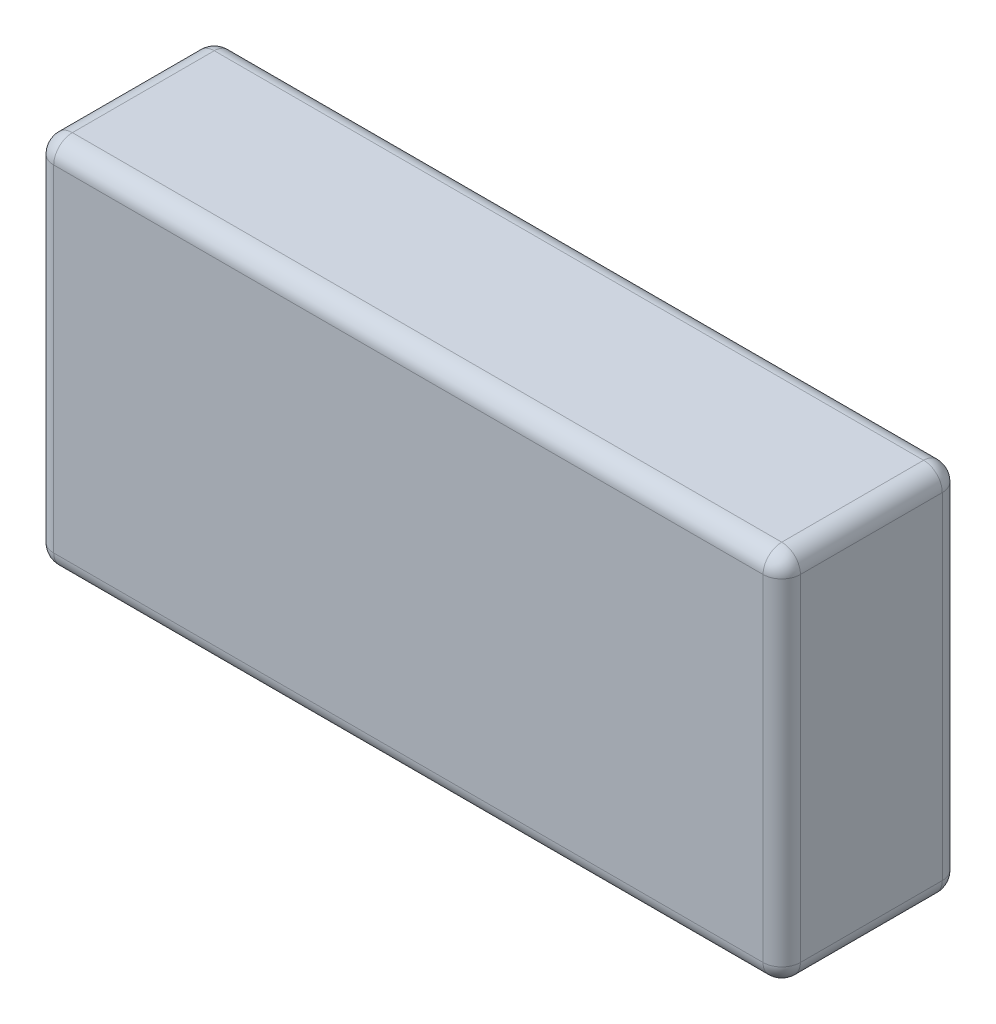
ISO-10303-21;
HEADER;
FILE_DESCRIPTION(('STEP AP214'),'2;1');
FILE_NAME('part.step','',(''),(''),'','','');
FILE_SCHEMA(('AUTOMOTIVE_DESIGN { 1 0 10303 214 1 1 1 1 }'));
ENDSEC;
DATA;
#1=APPLICATION_CONTEXT('core data for automotive mechanical design processes');
#2=APPLICATION_PROTOCOL_DEFINITION('international standard','automotive_design',2000,#1);
#3=PRODUCT_CONTEXT('',#1,'mechanical');
#4=PRODUCT('Part','Part','',(#3));
#5=PRODUCT_RELATED_PRODUCT_CATEGORY('part','',(#4));
#6=PRODUCT_DEFINITION_FORMATION('','',#4);
#7=PRODUCT_DEFINITION_CONTEXT('part definition',#1,'design');
#8=PRODUCT_DEFINITION('design','',#6,#7);
#9=PRODUCT_DEFINITION_SHAPE('','',#8);
#10=(LENGTH_UNIT() NAMED_UNIT(*) SI_UNIT(.MILLI.,.METRE.));
#11=(NAMED_UNIT(*) PLANE_ANGLE_UNIT() SI_UNIT($,.RADIAN.));
#12=(NAMED_UNIT(*) SI_UNIT($,.STERADIAN.) SOLID_ANGLE_UNIT());
#13=UNCERTAINTY_MEASURE_WITH_UNIT(LENGTH_MEASURE(1.E-05),#10,'distance_accuracy_value','');
#14=(GEOMETRIC_REPRESENTATION_CONTEXT(3) GLOBAL_UNCERTAINTY_ASSIGNED_CONTEXT((#13)) GLOBAL_UNIT_ASSIGNED_CONTEXT((#10,
#11,#12)) REPRESENTATION_CONTEXT('',''));
#15=CARTESIAN_POINT('',(0.,0.,0.));
#16=DIRECTION('',(0.,0.,1.));
#17=DIRECTION('',(1.,0.,0.));
#18=AXIS2_PLACEMENT_3D('',#15,#16,#17);
#19=CARTESIAN_POINT('',(-0.95,0.45,0.06));
#20=DIRECTION('',(-1.,0.,0.));
#21=DIRECTION('',(0.,-1.,0.));
#22=AXIS2_PLACEMENT_3D('',#19,#20,#21);
#23=SPHERICAL_SURFACE('',#22,0.05);
#24=CARTESIAN_POINT('',(-0.95,0.45,0.06));
#25=DIRECTION('',(1.,0.,0.));
#26=DIRECTION('',(0.,0.,-1.));
#27=AXIS2_PLACEMENT_3D('',#24,#25,#26);
#28=CIRCLE('',#27,0.05);
#29=CARTESIAN_POINT('',(-0.95,0.45,0.01));
#30=VERTEX_POINT('',#29);
#31=CARTESIAN_POINT('',(-0.95,0.5,0.060000000000012));
#32=VERTEX_POINT('',#31);
#33=EDGE_CURVE('E102',#30,#32,#28,.T.);
#34=ORIENTED_EDGE('',*,*,#33,.F.);
#35=CARTESIAN_POINT('',(-0.95,0.45,0.06));
#36=DIRECTION('',(0.,1.,0.));
#37=DIRECTION('',(0.,0.,1.));
#38=AXIS2_PLACEMENT_3D('',#35,#36,#37);
#39=CIRCLE('',#38,0.05);
#40=CARTESIAN_POINT('',(-1.,0.45,0.06));
#41=VERTEX_POINT('',#40);
#42=EDGE_CURVE('E279',#41,#30,#39,.F.);
#43=ORIENTED_EDGE('',*,*,#42,.F.);
#44=CARTESIAN_POINT('',(-0.95,0.45,0.06));
#45=DIRECTION('',(0.,0.,1.));
#46=DIRECTION('',(1.,0.,0.));
#47=AXIS2_PLACEMENT_3D('',#44,#45,#46);
#48=CIRCLE('',#47,0.05);
#49=EDGE_CURVE('E272',#32,#41,#48,.T.);
#50=ORIENTED_EDGE('',*,*,#49,.F.);
#51=EDGE_LOOP('',(#34,#43,#50));
#52=FACE_BOUND('',#51,.T.);
#53=ADVANCED_FACE('F16',(#52),#23,.T.);
#54=CARTESIAN_POINT('',(-0.95,-0.45,0.06));
#55=DIRECTION('',(-1.,0.,0.));
#56=DIRECTION('',(0.,0.,1.));
#57=AXIS2_PLACEMENT_3D('',#54,#55,#56);
#58=SPHERICAL_SURFACE('',#57,0.05);
#59=CARTESIAN_POINT('',(-0.95,-0.45,0.06));
#60=DIRECTION('',(-1.,0.,0.));
#61=DIRECTION('',(0.,0.,1.));
#62=AXIS2_PLACEMENT_3D('',#59,#60,#61);
#63=CIRCLE('',#62,0.05);
#64=CARTESIAN_POINT('',(-0.95,-0.5,0.06));
#65=VERTEX_POINT('',#64);
#66=CARTESIAN_POINT('',(-0.95,-0.45,0.01));
#67=VERTEX_POINT('',#66);
#68=EDGE_CURVE('E266',#65,#67,#63,.F.);
#69=ORIENTED_EDGE('',*,*,#68,.F.);
#70=CARTESIAN_POINT('',(-0.95,-0.45,0.06));
#71=DIRECTION('',(0.,0.,1.));
#72=DIRECTION('',(1.,0.,0.));
#73=AXIS2_PLACEMENT_3D('',#70,#71,#72);
#74=CIRCLE('',#73,0.05);
#75=CARTESIAN_POINT('',(-1.,-0.45,0.06));
#76=VERTEX_POINT('',#75);
#77=EDGE_CURVE('E269',#76,#65,#74,.T.);
#78=ORIENTED_EDGE('',*,*,#77,.F.);
#79=CARTESIAN_POINT('',(-0.95,-0.45,0.06));
#80=DIRECTION('',(0.,1.,0.));
#81=DIRECTION('',(0.,0.,1.));
#82=AXIS2_PLACEMENT_3D('',#79,#80,#81);
#83=CIRCLE('',#82,0.05);
#84=EDGE_CURVE('E275',#67,#76,#83,.T.);
#85=ORIENTED_EDGE('',*,*,#84,.F.);
#86=EDGE_LOOP('',(#69,#78,#85));
#87=FACE_BOUND('',#86,.T.);
#88=ADVANCED_FACE('F157',(#87),#58,.T.);
#89=CARTESIAN_POINT('',(-1.,0.5,0.01));
#90=DIRECTION('',(0.,0.,1.));
#91=DIRECTION('',(1.,0.,0.));
#92=AXIS2_PLACEMENT_3D('',#89,#90,#91);
#93=PLANE('',#92);
#94=DIRECTION('',(0.,1.,0.));
#95=VECTOR('',#94,1.);
#96=CARTESIAN_POINT('',(0.95,0.5,0.01));
#97=LINE('',#96,#95);
#98=CARTESIAN_POINT('',(0.950000000000096,-0.45,0.01));
#99=VERTEX_POINT('',#98);
#100=CARTESIAN_POINT('',(0.95,0.45,0.01));
#101=VERTEX_POINT('',#100);
#102=EDGE_CURVE('E108',#99,#101,#97,.T.);
#103=ORIENTED_EDGE('',*,*,#102,.F.);
#104=DIRECTION('',(-1.,0.,0.));
#105=VECTOR('',#104,1.);
#106=CARTESIAN_POINT('',(1.,-0.45,0.01));
#107=LINE('',#106,#105);
#108=EDGE_CURVE('E264',#67,#99,#107,.F.);
#109=ORIENTED_EDGE('',*,*,#108,.F.);
#110=DIRECTION('',(0.,1.,0.));
#111=VECTOR('',#110,1.);
#112=CARTESIAN_POINT('',(-0.95,-0.5,0.01));
#113=LINE('',#112,#111);
#114=EDGE_CURVE('E133',#30,#67,#113,.F.);
#115=ORIENTED_EDGE('',*,*,#114,.F.);
#116=DIRECTION('',(1.,0.,0.));
#117=VECTOR('',#116,1.);
#118=CARTESIAN_POINT('',(-1.,0.45,0.01));
#119=LINE('',#118,#117);
#120=EDGE_CURVE('E130',#101,#30,#119,.F.);
#121=ORIENTED_EDGE('',*,*,#120,.F.);
#122=EDGE_LOOP('',(#103,#109,#115,#121));
#123=FACE_BOUND('',#122,.T.);
#124=ADVANCED_FACE('F131',(#123),#93,.F.);
#125=CARTESIAN_POINT('',(0.95,-0.45,0.06));
#126=DIRECTION('',(0.,-1.,0.));
#127=DIRECTION('',(0.,0.,1.));
#128=AXIS2_PLACEMENT_3D('',#125,#126,#127);
#129=SPHERICAL_SURFACE('',#128,0.05);
#130=CARTESIAN_POINT('',(0.95,-0.45,0.06));
#131=DIRECTION('',(0.,-1.,0.));
#132=DIRECTION('',(0.,0.,-1.));
#133=AXIS2_PLACEMENT_3D('',#130,#131,#132);
#134=CIRCLE('',#133,0.05);
#135=CARTESIAN_POINT('',(1.,-0.45,0.06));
#136=VERTEX_POINT('',#135);
#137=EDGE_CURVE('E114',#136,#99,#134,.F.);
#138=ORIENTED_EDGE('',*,*,#137,.F.);
#139=CARTESIAN_POINT('',(0.95,-0.45,0.06));
#140=DIRECTION('',(0.,0.,1.));
#141=DIRECTION('',(1.,0.,0.));
#142=AXIS2_PLACEMENT_3D('',#139,#140,#141);
#143=CIRCLE('',#142,0.05);
#144=CARTESIAN_POINT('',(0.95,-0.5,0.06));
#145=VERTEX_POINT('',#144);
#146=EDGE_CURVE('E258',#145,#136,#143,.T.);
#147=ORIENTED_EDGE('',*,*,#146,.F.);
#148=CARTESIAN_POINT('',(0.95,-0.45,0.06));
#149=DIRECTION('',(-1.,0.,0.));
#150=DIRECTION('',(0.,0.,1.));
#151=AXIS2_PLACEMENT_3D('',#148,#149,#150);
#152=CIRCLE('',#151,0.05);
#153=EDGE_CURVE('E261',#99,#145,#152,.T.);
#154=ORIENTED_EDGE('',*,*,#153,.F.);
#155=EDGE_LOOP('',(#138,#147,#154));
#156=FACE_BOUND('',#155,.T.);
#157=ADVANCED_FACE('F151',(#156),#129,.T.);
#158=CARTESIAN_POINT('',(0.95,0.45,0.06));
#159=DIRECTION('',(0.,1.,0.));
#160=DIRECTION('',(0.,0.,-1.));
#161=AXIS2_PLACEMENT_3D('',#158,#159,#160);
#162=SPHERICAL_SURFACE('',#161,0.05);
#163=CARTESIAN_POINT('',(0.95,0.45,0.06));
#164=DIRECTION('',(0.,-1.,0.));
#165=DIRECTION('',(0.,0.,-1.));
#166=AXIS2_PLACEMENT_3D('',#163,#164,#165);
#167=CIRCLE('',#166,0.05);
#168=CARTESIAN_POINT('',(1.,0.45,0.06));
#169=VERTEX_POINT('',#168);
#170=EDGE_CURVE('E112',#101,#169,#167,.T.);
#171=ORIENTED_EDGE('',*,*,#170,.F.);
#172=CARTESIAN_POINT('',(0.95,0.45,0.06));
#173=DIRECTION('',(1.,0.,0.));
#174=DIRECTION('',(0.,0.,-1.));
#175=AXIS2_PLACEMENT_3D('',#172,#173,#174);
#176=CIRCLE('',#175,0.05);
#177=CARTESIAN_POINT('',(0.95,0.5,0.06));
#178=VERTEX_POINT('',#177);
#179=EDGE_CURVE('E120',#178,#101,#176,.F.);
#180=ORIENTED_EDGE('',*,*,#179,.F.);
#181=CARTESIAN_POINT('',(0.95,0.45,0.06));
#182=DIRECTION('',(0.,0.,1.));
#183=DIRECTION('',(1.,0.,0.));
#184=AXIS2_PLACEMENT_3D('',#181,#182,#183);
#185=CIRCLE('',#184,0.05);
#186=EDGE_CURVE('E126',#169,#178,#185,.T.);
#187=ORIENTED_EDGE('',*,*,#186,.F.);
#188=EDGE_LOOP('',(#171,#180,#187));
#189=FACE_BOUND('',#188,.T.);
#190=ADVANCED_FACE('F123',(#189),#162,.T.);
#191=CARTESIAN_POINT('',(-1.,0.45,0.06));
#192=DIRECTION('',(1.,0.,0.));
#193=DIRECTION('',(0.,0.,-1.));
#194=AXIS2_PLACEMENT_3D('',#191,#192,#193);
#195=CYLINDRICAL_SURFACE('',#194,0.05);
#196=ORIENTED_EDGE('',*,*,#120,.T.);
#197=ORIENTED_EDGE('',*,*,#33,.T.);
#198=DIRECTION('',(1.,0.,0.));
#199=VECTOR('',#198,1.);
#200=CARTESIAN_POINT('',(-1.,0.5,0.06));
#201=LINE('',#200,#199);
#202=EDGE_CURVE('E139',#178,#32,#201,.F.);
#203=ORIENTED_EDGE('',*,*,#202,.F.);
#204=ORIENTED_EDGE('',*,*,#179,.T.);
#205=EDGE_LOOP('',(#196,#197,#203,#204));
#206=FACE_BOUND('',#205,.T.);
#207=ADVANCED_FACE('F137',(#206),#195,.T.);
#208=CARTESIAN_POINT('',(-0.95,-0.5,0.06));
#209=DIRECTION('',(0.,1.,0.));
#210=DIRECTION('',(0.,0.,1.));
#211=AXIS2_PLACEMENT_3D('',#208,#209,#210);
#212=CYLINDRICAL_SURFACE('',#211,0.05);
#213=ORIENTED_EDGE('',*,*,#84,.T.);
#214=DIRECTION('',(0.,1.,0.));
#215=VECTOR('',#214,1.);
#216=CARTESIAN_POINT('',(-1.,-0.5,0.06));
#217=LINE('',#216,#215);
#218=EDGE_CURVE('E244',#41,#76,#217,.F.);
#219=ORIENTED_EDGE('',*,*,#218,.F.);
#220=ORIENTED_EDGE('',*,*,#42,.T.);
#221=ORIENTED_EDGE('',*,*,#114,.T.);
#222=EDGE_LOOP('',(#213,#219,#220,#221));
#223=FACE_BOUND('',#222,.T.);
#224=ADVANCED_FACE('F357',(#223),#212,.T.);
#225=CARTESIAN_POINT('',(-0.95,0.45,0.01));
#226=DIRECTION('',(0.,0.,1.));
#227=DIRECTION('',(1.,0.,0.));
#228=AXIS2_PLACEMENT_3D('',#225,#226,#227);
#229=CYLINDRICAL_SURFACE('',#228,0.05);
#230=DIRECTION('',(0.,0.,1.));
#231=VECTOR('',#230,1.);
#232=CARTESIAN_POINT('',(-1.,0.45,0.01));
#233=LINE('',#232,#231);
#234=CARTESIAN_POINT('',(-1.,0.45,0.44));
#235=VERTEX_POINT('',#234);
#236=EDGE_CURVE('E247',#235,#41,#233,.F.);
#237=ORIENTED_EDGE('',*,*,#236,.F.);
#238=CARTESIAN_POINT('',(-0.95,0.45,0.44));
#239=DIRECTION('',(0.,0.,1.));
#240=DIRECTION('',(0.,1.,0.));
#241=AXIS2_PLACEMENT_3D('',#238,#239,#240);
#242=CIRCLE('',#241,0.05);
#243=CARTESIAN_POINT('',(-0.95,0.5,0.44));
#244=VERTEX_POINT('',#243);
#245=EDGE_CURVE('E238',#244,#235,#242,.T.);
#246=ORIENTED_EDGE('',*,*,#245,.F.);
#247=DIRECTION('',(0.,0.,1.));
#248=VECTOR('',#247,1.);
#249=CARTESIAN_POINT('',(-0.95,0.5,0.01));
#250=LINE('',#249,#248);
#251=EDGE_CURVE('E250',#32,#244,#250,.T.);
#252=ORIENTED_EDGE('',*,*,#251,.F.);
#253=ORIENTED_EDGE('',*,*,#49,.T.);
#254=EDGE_LOOP('',(#237,#246,#252,#253));
#255=FACE_BOUND('',#254,.T.);
#256=ADVANCED_FACE('F282',(#255),#229,.T.);
#257=CARTESIAN_POINT('',(-0.95,-0.45,0.01));
#258=DIRECTION('',(0.,0.,1.));
#259=DIRECTION('',(1.,0.,0.));
#260=AXIS2_PLACEMENT_3D('',#257,#258,#259);
#261=CYLINDRICAL_SURFACE('',#260,0.05);
#262=DIRECTION('',(0.,0.,1.));
#263=VECTOR('',#262,1.);
#264=CARTESIAN_POINT('',(-1.,-0.45,0.01));
#265=LINE('',#264,#263);
#266=CARTESIAN_POINT('',(-1.,-0.45,0.44));
#267=VERTEX_POINT('',#266);
#268=EDGE_CURVE('E241',#76,#267,#265,.T.);
#269=ORIENTED_EDGE('',*,*,#268,.F.);
#270=ORIENTED_EDGE('',*,*,#77,.T.);
#271=DIRECTION('',(0.,0.,-1.));
#272=VECTOR('',#271,1.);
#273=CARTESIAN_POINT('',(-0.95,-0.5,0.01));
#274=LINE('',#273,#272);
#275=CARTESIAN_POINT('',(-0.95,-0.5,0.44));
#276=VERTEX_POINT('',#275);
#277=EDGE_CURVE('E217',#276,#65,#274,.T.);
#278=ORIENTED_EDGE('',*,*,#277,.F.);
#279=CARTESIAN_POINT('',(-0.95,-0.45,0.44));
#280=DIRECTION('',(0.,0.,1.));
#281=DIRECTION('',(-1.,0.,0.));
#282=AXIS2_PLACEMENT_3D('',#279,#280,#281);
#283=CIRCLE('',#282,0.05);
#284=EDGE_CURVE('E220',#267,#276,#283,.T.);
#285=ORIENTED_EDGE('',*,*,#284,.F.);
#286=EDGE_LOOP('',(#269,#270,#278,#285));
#287=FACE_BOUND('',#286,.T.);
#288=ADVANCED_FACE('F359',(#287),#261,.T.);
#289=CARTESIAN_POINT('',(1.,-0.45,0.06));
#290=DIRECTION('',(-1.,0.,0.));
#291=DIRECTION('',(0.,0.,1.));
#292=AXIS2_PLACEMENT_3D('',#289,#290,#291);
#293=CYLINDRICAL_SURFACE('',#292,0.05);
#294=ORIENTED_EDGE('',*,*,#153,.T.);
#295=DIRECTION('',(1.,0.,0.));
#296=VECTOR('',#295,1.);
#297=CARTESIAN_POINT('',(1.,-0.5,0.06));
#298=LINE('',#297,#296);
#299=EDGE_CURVE('E214',#65,#145,#298,.T.);
#300=ORIENTED_EDGE('',*,*,#299,.F.);
#301=ORIENTED_EDGE('',*,*,#68,.T.);
#302=ORIENTED_EDGE('',*,*,#108,.T.);
#303=EDGE_LOOP('',(#294,#300,#301,#302));
#304=FACE_BOUND('',#303,.T.);
#305=ADVANCED_FACE('F355',(#304),#293,.T.);
#306=CARTESIAN_POINT('',(0.95,-0.45,0.01));
#307=DIRECTION('',(0.,0.,1.));
#308=DIRECTION('',(1.,0.,0.));
#309=AXIS2_PLACEMENT_3D('',#306,#307,#308);
#310=CYLINDRICAL_SURFACE('',#309,0.05);
#311=DIRECTION('',(0.,0.,-1.));
#312=VECTOR('',#311,1.);
#313=CARTESIAN_POINT('',(0.95,-0.5,0.01));
#314=LINE('',#313,#312);
#315=CARTESIAN_POINT('',(0.95,-0.5,0.44));
#316=VERTEX_POINT('',#315);
#317=EDGE_CURVE('E211',#145,#316,#314,.F.);
#318=ORIENTED_EDGE('',*,*,#317,.F.);
#319=ORIENTED_EDGE('',*,*,#146,.T.);
#320=DIRECTION('',(0.,0.,-1.));
#321=VECTOR('',#320,1.);
#322=CARTESIAN_POINT('',(1.,-0.45,0.01));
#323=LINE('',#322,#321);
#324=CARTESIAN_POINT('',(1.,-0.45,0.44));
#325=VERTEX_POINT('',#324);
#326=EDGE_CURVE('E203',#325,#136,#323,.T.);
#327=ORIENTED_EDGE('',*,*,#326,.F.);
#328=CARTESIAN_POINT('',(0.95,-0.45,0.44));
#329=DIRECTION('',(0.,0.,-1.));
#330=DIRECTION('',(1.,0.,0.));
#331=AXIS2_PLACEMENT_3D('',#328,#329,#330);
#332=CIRCLE('',#331,0.05);
#333=EDGE_CURVE('E205',#316,#325,#332,.F.);
#334=ORIENTED_EDGE('',*,*,#333,.F.);
#335=EDGE_LOOP('',(#318,#319,#327,#334));
#336=FACE_BOUND('',#335,.T.);
#337=ADVANCED_FACE('F353',(#336),#310,.T.);
#338=CARTESIAN_POINT('',(0.95,0.5,0.06));
#339=DIRECTION('',(0.,-1.,0.));
#340=DIRECTION('',(0.,0.,-1.));
#341=AXIS2_PLACEMENT_3D('',#338,#339,#340);
#342=CYLINDRICAL_SURFACE('',#341,0.05);
#343=ORIENTED_EDGE('',*,*,#102,.T.);
#344=ORIENTED_EDGE('',*,*,#170,.T.);
#345=DIRECTION('',(0.,1.,0.));
#346=VECTOR('',#345,1.);
#347=CARTESIAN_POINT('',(1.,0.5,0.06));
#348=LINE('',#347,#346);
#349=EDGE_CURVE('E298',#136,#169,#348,.T.);
#350=ORIENTED_EDGE('',*,*,#349,.F.);
#351=ORIENTED_EDGE('',*,*,#137,.T.);
#352=EDGE_LOOP('',(#343,#344,#350,#351));
#353=FACE_BOUND('',#352,.T.);
#354=ADVANCED_FACE('F110',(#353),#342,.T.);
#355=CARTESIAN_POINT('',(0.95,0.45,0.01));
#356=DIRECTION('',(0.,0.,1.));
#357=DIRECTION('',(1.,0.,0.));
#358=AXIS2_PLACEMENT_3D('',#355,#356,#357);
#359=CYLINDRICAL_SURFACE('',#358,0.05);
#360=DIRECTION('',(0.,0.,-1.));
#361=VECTOR('',#360,1.);
#362=CARTESIAN_POINT('',(1.,0.45,0.01));
#363=LINE('',#362,#361);
#364=CARTESIAN_POINT('',(1.,0.45,0.44));
#365=VERTEX_POINT('',#364);
#366=EDGE_CURVE('E294',#169,#365,#363,.F.);
#367=ORIENTED_EDGE('',*,*,#366,.F.);
#368=ORIENTED_EDGE('',*,*,#186,.T.);
#369=DIRECTION('',(0.,0.,1.));
#370=VECTOR('',#369,1.);
#371=CARTESIAN_POINT('',(0.95,0.5,0.01));
#372=LINE('',#371,#370);
#373=CARTESIAN_POINT('',(0.95,0.5,0.44));
#374=VERTEX_POINT('',#373);
#375=EDGE_CURVE('E254',#374,#178,#372,.F.);
#376=ORIENTED_EDGE('',*,*,#375,.F.);
#377=CARTESIAN_POINT('',(0.95,0.45,0.44));
#378=DIRECTION('',(0.,0.,1.));
#379=DIRECTION('',(0.,1.,0.));
#380=AXIS2_PLACEMENT_3D('',#377,#378,#379);
#381=CIRCLE('',#380,0.05);
#382=EDGE_CURVE('E206',#365,#374,#381,.T.);
#383=ORIENTED_EDGE('',*,*,#382,.F.);
#384=EDGE_LOOP('',(#367,#368,#376,#383));
#385=FACE_BOUND('',#384,.T.);
#386=ADVANCED_FACE('F291',(#385),#359,.T.);
#387=CARTESIAN_POINT('',(-1.,0.5,0.01));
#388=DIRECTION('',(0.,1.,0.));
#389=DIRECTION('',(0.,0.,1.));
#390=AXIS2_PLACEMENT_3D('',#387,#388,#389);
#391=PLANE('',#390);
#392=ORIENTED_EDGE('',*,*,#202,.T.);
#393=ORIENTED_EDGE('',*,*,#251,.T.);
#394=DIRECTION('',(1.,0.,0.));
#395=VECTOR('',#394,1.);
#396=CARTESIAN_POINT('',(-1.,0.5,0.44));
#397=LINE('',#396,#395);
#398=EDGE_CURVE('E289',#374,#244,#397,.F.);
#399=ORIENTED_EDGE('',*,*,#398,.F.);
#400=ORIENTED_EDGE('',*,*,#375,.T.);
#401=EDGE_LOOP('',(#392,#393,#399,#400));
#402=FACE_BOUND('',#401,.T.);
#403=ADVANCED_FACE('F287',(#402),#391,.T.);
#404=CARTESIAN_POINT('',(-1.,-0.5,0.01));
#405=DIRECTION('',(-1.,0.,0.));
#406=DIRECTION('',(0.,0.,1.));
#407=AXIS2_PLACEMENT_3D('',#404,#405,#406);
#408=PLANE('',#407);
#409=ORIENTED_EDGE('',*,*,#268,.T.);
#410=DIRECTION('',(0.,1.,0.));
#411=VECTOR('',#410,1.);
#412=CARTESIAN_POINT('',(-1.,-0.5,0.44));
#413=LINE('',#412,#411);
#414=EDGE_CURVE('E309',#235,#267,#413,.F.);
#415=ORIENTED_EDGE('',*,*,#414,.F.);
#416=ORIENTED_EDGE('',*,*,#236,.T.);
#417=ORIENTED_EDGE('',*,*,#218,.T.);
#418=EDGE_LOOP('',(#409,#415,#416,#417));
#419=FACE_BOUND('',#418,.T.);
#420=ADVANCED_FACE('F233',(#419),#408,.T.);
#421=CARTESIAN_POINT('',(-0.95,0.45,0.44));
#422=DIRECTION('',(0.,1.,0.));
#423=DIRECTION('',(0.,0.,1.));
#424=AXIS2_PLACEMENT_3D('',#421,#422,#423);
#425=SPHERICAL_SURFACE('',#424,0.05);
#426=CARTESIAN_POINT('',(-0.95,0.45,0.44));
#427=DIRECTION('',(0.,1.,0.));
#428=DIRECTION('',(0.,0.,1.));
#429=AXIS2_PLACEMENT_3D('',#426,#427,#428);
#430=CIRCLE('',#429,0.05);
#431=CARTESIAN_POINT('',(-0.95,0.45,0.49));
#432=VERTEX_POINT('',#431);
#433=EDGE_CURVE('E315',#432,#235,#430,.F.);
#434=ORIENTED_EDGE('',*,*,#433,.F.);
#435=CARTESIAN_POINT('',(-0.95,0.45,0.44));
#436=DIRECTION('',(1.,0.,0.));
#437=DIRECTION('',(0.,0.,-1.));
#438=AXIS2_PLACEMENT_3D('',#435,#436,#437);
#439=CIRCLE('',#438,0.05);
#440=EDGE_CURVE('E303',#244,#432,#439,.T.);
#441=ORIENTED_EDGE('',*,*,#440,.F.);
#442=ORIENTED_EDGE('',*,*,#245,.T.);
#443=EDGE_LOOP('',(#434,#441,#442));
#444=FACE_BOUND('',#443,.T.);
#445=ADVANCED_FACE('F229',(#444),#425,.T.);
#446=CARTESIAN_POINT('',(-0.95,-0.45,0.44));
#447=DIRECTION('',(-1.,0.,0.));
#448=DIRECTION('',(0.,0.,1.));
#449=AXIS2_PLACEMENT_3D('',#446,#447,#448);
#450=SPHERICAL_SURFACE('',#449,0.05);
#451=CARTESIAN_POINT('',(-0.95,-0.45,0.44));
#452=DIRECTION('',(-1.,0.,0.));
#453=DIRECTION('',(0.,0.,1.));
#454=AXIS2_PLACEMENT_3D('',#451,#452,#453);
#455=CIRCLE('',#454,0.05);
#456=CARTESIAN_POINT('',(-0.95,-0.45,0.49));
#457=VERTEX_POINT('',#456);
#458=EDGE_CURVE('E320',#457,#276,#455,.F.);
#459=ORIENTED_EDGE('',*,*,#458,.F.);
#460=CARTESIAN_POINT('',(-0.95,-0.45,0.44));
#461=DIRECTION('',(0.,1.,0.));
#462=DIRECTION('',(0.,0.,1.));
#463=AXIS2_PLACEMENT_3D('',#460,#461,#462);
#464=CIRCLE('',#463,0.05);
#465=EDGE_CURVE('E312',#267,#457,#464,.T.);
#466=ORIENTED_EDGE('',*,*,#465,.F.);
#467=ORIENTED_EDGE('',*,*,#284,.T.);
#468=EDGE_LOOP('',(#459,#466,#467));
#469=FACE_BOUND('',#468,.T.);
#470=ADVANCED_FACE('F225',(#469),#450,.T.);
#471=CARTESIAN_POINT('',(1.,-0.5,0.01));
#472=DIRECTION('',(0.,-1.,0.));
#473=DIRECTION('',(0.,0.,-1.));
#474=AXIS2_PLACEMENT_3D('',#471,#472,#473);
#475=PLANE('',#474);
#476=ORIENTED_EDGE('',*,*,#317,.T.);
#477=DIRECTION('',(-1.,0.,0.));
#478=VECTOR('',#477,1.);
#479=CARTESIAN_POINT('',(1.,-0.5,0.44));
#480=LINE('',#479,#478);
#481=EDGE_CURVE('E323',#276,#316,#480,.F.);
#482=ORIENTED_EDGE('',*,*,#481,.F.);
#483=ORIENTED_EDGE('',*,*,#277,.T.);
#484=ORIENTED_EDGE('',*,*,#299,.T.);
#485=EDGE_LOOP('',(#476,#482,#483,#484));
#486=FACE_BOUND('',#485,.T.);
#487=ADVANCED_FACE('F228',(#486),#475,.T.);
#488=CARTESIAN_POINT('',(0.95,0.45,0.44));
#489=DIRECTION('',(0.,0.,1.));
#490=DIRECTION('',(0.,1.,0.));
#491=AXIS2_PLACEMENT_3D('',#488,#489,#490);
#492=SPHERICAL_SURFACE('',#491,0.05);
#493=ORIENTED_EDGE('',*,*,#382,.T.);
#494=CARTESIAN_POINT('',(0.95,0.45,0.44));
#495=DIRECTION('',(1.,0.,0.));
#496=DIRECTION('',(0.,0.,-1.));
#497=AXIS2_PLACEMENT_3D('',#494,#495,#496);
#498=CIRCLE('',#497,0.05);
#499=CARTESIAN_POINT('',(0.95,0.45,0.49));
#500=VERTEX_POINT('',#499);
#501=EDGE_CURVE('E306',#500,#374,#498,.F.);
#502=ORIENTED_EDGE('',*,*,#501,.F.);
#503=CARTESIAN_POINT('',(0.95,0.45,0.44));
#504=DIRECTION('',(0.,-1.,0.));
#505=DIRECTION('',(0.,0.,-1.));
#506=AXIS2_PLACEMENT_3D('',#503,#504,#505);
#507=CIRCLE('',#506,0.05);
#508=EDGE_CURVE('E326',#365,#500,#507,.T.);
#509=ORIENTED_EDGE('',*,*,#508,.F.);
#510=EDGE_LOOP('',(#493,#502,#509));
#511=FACE_BOUND('',#510,.T.);
#512=ADVANCED_FACE('F197',(#511),#492,.T.);
#513=CARTESIAN_POINT('',(0.95,-0.45,0.44));
#514=DIRECTION('',(1.,0.,0.));
#515=DIRECTION('',(0.,-1.,0.));
#516=AXIS2_PLACEMENT_3D('',#513,#514,#515);
#517=SPHERICAL_SURFACE('',#516,0.05);
#518=CARTESIAN_POINT('',(0.95,-0.45,0.44));
#519=DIRECTION('',(-1.,0.,0.));
#520=DIRECTION('',(0.,0.,1.));
#521=AXIS2_PLACEMENT_3D('',#518,#519,#520);
#522=CIRCLE('',#521,0.05);
#523=CARTESIAN_POINT('',(0.95,-0.449999999999904,0.49));
#524=VERTEX_POINT('',#523);
#525=EDGE_CURVE('E318',#316,#524,#522,.T.);
#526=ORIENTED_EDGE('',*,*,#525,.F.);
#527=ORIENTED_EDGE('',*,*,#333,.T.);
#528=CARTESIAN_POINT('',(0.95,-0.45,0.44));
#529=DIRECTION('',(0.,-1.,0.));
#530=DIRECTION('',(0.,0.,-1.));
#531=AXIS2_PLACEMENT_3D('',#528,#529,#530);
#532=CIRCLE('',#531,0.05);
#533=EDGE_CURVE('E34',#524,#325,#532,.F.);
#534=ORIENTED_EDGE('',*,*,#533,.F.);
#535=EDGE_LOOP('',(#526,#527,#534));
#536=FACE_BOUND('',#535,.T.);
#537=ADVANCED_FACE('F192',(#536),#517,.T.);
#538=CARTESIAN_POINT('',(1.,0.5,0.01));
#539=DIRECTION('',(1.,0.,0.));
#540=DIRECTION('',(0.,0.,-1.));
#541=AXIS2_PLACEMENT_3D('',#538,#539,#540);
#542=PLANE('',#541);
#543=ORIENTED_EDGE('',*,*,#366,.T.);
#544=DIRECTION('',(0.,-1.,0.));
#545=VECTOR('',#544,1.);
#546=CARTESIAN_POINT('',(1.,0.5,0.44));
#547=LINE('',#546,#545);
#548=EDGE_CURVE('E330',#325,#365,#547,.F.);
#549=ORIENTED_EDGE('',*,*,#548,.F.);
#550=ORIENTED_EDGE('',*,*,#326,.T.);
#551=ORIENTED_EDGE('',*,*,#349,.T.);
#552=EDGE_LOOP('',(#543,#549,#550,#551));
#553=FACE_BOUND('',#552,.T.);
#554=ADVANCED_FACE('F188',(#553),#542,.T.);
#555=CARTESIAN_POINT('',(-1.,0.45,0.44));
#556=DIRECTION('',(1.,0.,0.));
#557=DIRECTION('',(0.,0.,-1.));
#558=AXIS2_PLACEMENT_3D('',#555,#556,#557);
#559=CYLINDRICAL_SURFACE('',#558,0.05);
#560=DIRECTION('',(1.,0.,0.));
#561=VECTOR('',#560,1.);
#562=CARTESIAN_POINT('',(-1.,0.45,0.49));
#563=LINE('',#562,#561);
#564=EDGE_CURVE('E332',#500,#432,#563,.F.);
#565=ORIENTED_EDGE('',*,*,#564,.F.);
#566=ORIENTED_EDGE('',*,*,#501,.T.);
#567=ORIENTED_EDGE('',*,*,#398,.T.);
#568=ORIENTED_EDGE('',*,*,#440,.T.);
#569=EDGE_LOOP('',(#565,#566,#567,#568));
#570=FACE_BOUND('',#569,.T.);
#571=ADVANCED_FACE('F184',(#570),#559,.T.);
#572=CARTESIAN_POINT('',(-0.95,-0.5,0.44));
#573=DIRECTION('',(0.,1.,0.));
#574=DIRECTION('',(0.,0.,1.));
#575=AXIS2_PLACEMENT_3D('',#572,#573,#574);
#576=CYLINDRICAL_SURFACE('',#575,0.05);
#577=DIRECTION('',(0.,1.,0.));
#578=VECTOR('',#577,1.);
#579=CARTESIAN_POINT('',(-0.95,0.5,0.49));
#580=LINE('',#579,#578);
#581=EDGE_CURVE('E335',#432,#457,#580,.F.);
#582=ORIENTED_EDGE('',*,*,#581,.F.);
#583=ORIENTED_EDGE('',*,*,#433,.T.);
#584=ORIENTED_EDGE('',*,*,#414,.T.);
#585=ORIENTED_EDGE('',*,*,#465,.T.);
#586=EDGE_LOOP('',(#582,#583,#584,#585));
#587=FACE_BOUND('',#586,.T.);
#588=ADVANCED_FACE('F180',(#587),#576,.T.);
#589=CARTESIAN_POINT('',(1.,-0.45,0.44));
#590=DIRECTION('',(-1.,0.,0.));
#591=DIRECTION('',(0.,0.,1.));
#592=AXIS2_PLACEMENT_3D('',#589,#590,#591);
#593=CYLINDRICAL_SURFACE('',#592,0.05);
#594=ORIENTED_EDGE('',*,*,#458,.T.);
#595=ORIENTED_EDGE('',*,*,#481,.T.);
#596=ORIENTED_EDGE('',*,*,#525,.T.);
#597=DIRECTION('',(1.,0.,0.));
#598=VECTOR('',#597,1.);
#599=CARTESIAN_POINT('',(-1.,-0.45,0.49));
#600=LINE('',#599,#598);
#601=EDGE_CURVE('E25',#457,#524,#600,.T.);
#602=ORIENTED_EDGE('',*,*,#601,.F.);
#603=EDGE_LOOP('',(#594,#595,#596,#602));
#604=FACE_BOUND('',#603,.T.);
#605=ADVANCED_FACE('F173',(#604),#593,.T.);
#606=CARTESIAN_POINT('',(0.95,0.5,0.44));
#607=DIRECTION('',(0.,-1.,0.));
#608=DIRECTION('',(0.,0.,-1.));
#609=AXIS2_PLACEMENT_3D('',#606,#607,#608);
#610=CYLINDRICAL_SURFACE('',#609,0.05);
#611=ORIENTED_EDGE('',*,*,#533,.T.);
#612=ORIENTED_EDGE('',*,*,#548,.T.);
#613=ORIENTED_EDGE('',*,*,#508,.T.);
#614=DIRECTION('',(0.,1.,0.));
#615=VECTOR('',#614,1.);
#616=CARTESIAN_POINT('',(0.95,0.5,0.49));
#617=LINE('',#616,#615);
#618=EDGE_CURVE('E10',#524,#500,#617,.T.);
#619=ORIENTED_EDGE('',*,*,#618,.F.);
#620=EDGE_LOOP('',(#611,#612,#613,#619));
#621=FACE_BOUND('',#620,.T.);
#622=ADVANCED_FACE('F167',(#621),#610,.T.);
#623=CARTESIAN_POINT('',(-1.,0.5,0.49));
#624=DIRECTION('',(0.,0.,1.));
#625=DIRECTION('',(1.,0.,0.));
#626=AXIS2_PLACEMENT_3D('',#623,#624,#625);
#627=PLANE('',#626);
#628=ORIENTED_EDGE('',*,*,#601,.T.);
#629=ORIENTED_EDGE('',*,*,#618,.T.);
#630=ORIENTED_EDGE('',*,*,#564,.T.);
#631=ORIENTED_EDGE('',*,*,#581,.T.);
#632=EDGE_LOOP('',(#628,#629,#630,#631));
#633=FACE_BOUND('',#632,.T.);
#634=ADVANCED_FACE('F165',(#633),#627,.T.);
#635=CLOSED_SHELL('',(#53,#88,#124,#157,#190,#207,#224,#256,#288,#305,#337,#354,#386,#403,#420,
#445,#470,#487,#512,#537,#554,#571,#588,#605,#622,#634));
#636=MANIFOLD_SOLID_BREP('B1',#635);
#637=ADVANCED_BREP_SHAPE_REPRESENTATION('',(#18,#636),#14);
#638=SHAPE_DEFINITION_REPRESENTATION(#9,#637);
ENDSEC;
END-ISO-10303-21;
